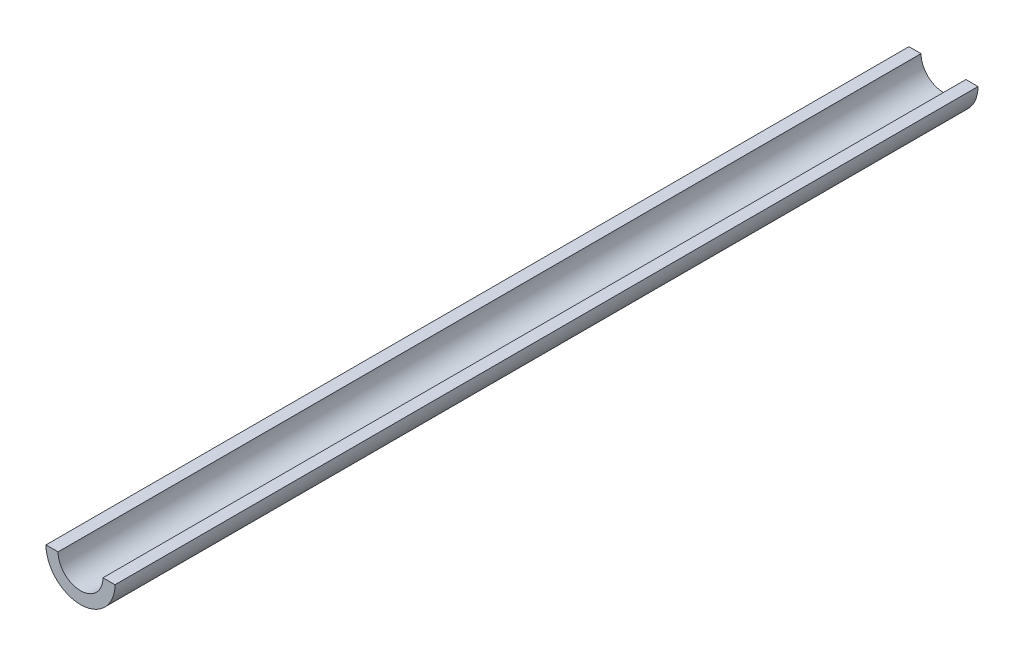
ISO-10303-21;
HEADER;
FILE_DESCRIPTION(('STEP AP214'),'2;1');
FILE_NAME('part.step','',(''),(''),'','','');
FILE_SCHEMA(('AUTOMOTIVE_DESIGN { 1 0 10303 214 1 1 1 1 }'));
ENDSEC;
DATA;
#1=APPLICATION_CONTEXT('core data for automotive mechanical design processes');
#2=APPLICATION_PROTOCOL_DEFINITION('international standard','automotive_design',2000,#1);
#3=PRODUCT_CONTEXT('',#1,'mechanical');
#4=PRODUCT('Part','Part','',(#3));
#5=PRODUCT_RELATED_PRODUCT_CATEGORY('part','',(#4));
#6=PRODUCT_DEFINITION_FORMATION('','',#4);
#7=PRODUCT_DEFINITION_CONTEXT('part definition',#1,'design');
#8=PRODUCT_DEFINITION('design','',#6,#7);
#9=PRODUCT_DEFINITION_SHAPE('','',#8);
#10=(LENGTH_UNIT() NAMED_UNIT(*) SI_UNIT(.MILLI.,.METRE.));
#11=(NAMED_UNIT(*) PLANE_ANGLE_UNIT() SI_UNIT($,.RADIAN.));
#12=(NAMED_UNIT(*) SI_UNIT($,.STERADIAN.) SOLID_ANGLE_UNIT());
#13=UNCERTAINTY_MEASURE_WITH_UNIT(LENGTH_MEASURE(1.E-05),#10,'distance_accuracy_value','');
#14=(GEOMETRIC_REPRESENTATION_CONTEXT(3) GLOBAL_UNCERTAINTY_ASSIGNED_CONTEXT((#13)) GLOBAL_UNIT_ASSIGNED_CONTEXT((#10,
#11,#12)) REPRESENTATION_CONTEXT('',''));
#15=CARTESIAN_POINT('',(0.,0.,0.));
#16=DIRECTION('',(0.,0.,1.));
#17=DIRECTION('',(1.,0.,0.));
#18=AXIS2_PLACEMENT_3D('',#15,#16,#17);
#19=CARTESIAN_POINT('',(0.,0.,125.));
#20=DIRECTION('',(0.,0.,-1.));
#21=DIRECTION('',(-1.,0.,0.));
#22=AXIS2_PLACEMENT_3D('',#19,#20,#21);
#23=CYLINDRICAL_SURFACE('',#22,6.5);
#24=CARTESIAN_POINT('',(0.,0.,-125.));
#25=DIRECTION('',(0.,0.,-1.));
#26=DIRECTION('',(1.,0.,0.));
#27=AXIS2_PLACEMENT_3D('',#24,#25,#26);
#28=CIRCLE('',#27,6.5);
#29=CARTESIAN_POINT('',(6.5,0.,-125.));
#30=VERTEX_POINT('',#29);
#31=CARTESIAN_POINT('',(-6.5,0.,-125.));
#32=VERTEX_POINT('',#31);
#33=EDGE_CURVE('E100',#30,#32,#28,.T.);
#34=ORIENTED_EDGE('',*,*,#33,.T.);
#35=DIRECTION('',(0.,0.,-1.));
#36=VECTOR('',#35,1.);
#37=CARTESIAN_POINT('',(-6.5,0.,125.));
#38=LINE('',#37,#36);
#39=CARTESIAN_POINT('',(-6.5,0.,125.));
#40=VERTEX_POINT('',#39);
#41=EDGE_CURVE('E11',#40,#32,#38,.T.);
#42=ORIENTED_EDGE('',*,*,#41,.F.);
#43=CARTESIAN_POINT('',(0.,0.,125.));
#44=DIRECTION('',(0.,0.,-1.));
#45=DIRECTION('',(1.,0.,0.));
#46=AXIS2_PLACEMENT_3D('',#43,#44,#45);
#47=CIRCLE('',#46,6.5);
#48=CARTESIAN_POINT('',(6.5,0.,125.));
#49=VERTEX_POINT('',#48);
#50=EDGE_CURVE('E88',#49,#40,#47,.T.);
#51=ORIENTED_EDGE('',*,*,#50,.F.);
#52=DIRECTION('',(0.,0.,-1.));
#53=VECTOR('',#52,1.);
#54=CARTESIAN_POINT('',(6.5,0.,125.));
#55=LINE('',#54,#53);
#56=EDGE_CURVE('E96',#49,#30,#55,.T.);
#57=ORIENTED_EDGE('',*,*,#56,.T.);
#58=EDGE_LOOP('',(#34,#42,#51,#57));
#59=FACE_BOUND('',#58,.T.);
#60=ADVANCED_FACE('F37',(#59),#23,.F.);
#61=CARTESIAN_POINT('',(-6.5,0.,125.));
#62=DIRECTION('',(0.,-1.,0.));
#63=DIRECTION('',(1.,0.,0.));
#64=AXIS2_PLACEMENT_3D('',#61,#62,#63);
#65=PLANE('',#64);
#66=DIRECTION('',(-1.,0.,0.));
#67=VECTOR('',#66,1.);
#68=CARTESIAN_POINT('',(-6.5,0.,-125.));
#69=LINE('',#68,#67);
#70=CARTESIAN_POINT('',(-10.,0.,-125.));
#71=VERTEX_POINT('',#70);
#72=EDGE_CURVE('E92',#32,#71,#69,.T.);
#73=ORIENTED_EDGE('',*,*,#72,.T.);
#74=DIRECTION('',(0.,0.,-1.));
#75=VECTOR('',#74,1.);
#76=CARTESIAN_POINT('',(-10.,0.,125.));
#77=LINE('',#76,#75);
#78=CARTESIAN_POINT('',(-10.,0.,125.));
#79=VERTEX_POINT('',#78);
#80=EDGE_CURVE('E45',#79,#71,#77,.T.);
#81=ORIENTED_EDGE('',*,*,#80,.F.);
#82=DIRECTION('',(-1.,0.,0.));
#83=VECTOR('',#82,1.);
#84=CARTESIAN_POINT('',(-6.5,0.,125.));
#85=LINE('',#84,#83);
#86=EDGE_CURVE('E83',#40,#79,#85,.T.);
#87=ORIENTED_EDGE('',*,*,#86,.F.);
#88=ORIENTED_EDGE('',*,*,#41,.T.);
#89=EDGE_LOOP('',(#73,#81,#87,#88));
#90=FACE_BOUND('',#89,.T.);
#91=ADVANCED_FACE('F91',(#90),#65,.F.);
#92=CARTESIAN_POINT('',(0.,0.,125.));
#93=DIRECTION('',(0.,0.,-1.));
#94=DIRECTION('',(-1.,0.,0.));
#95=AXIS2_PLACEMENT_3D('',#92,#93,#94);
#96=CYLINDRICAL_SURFACE('',#95,10.);
#97=CARTESIAN_POINT('',(0.,0.,-125.));
#98=DIRECTION('',(0.,0.,1.));
#99=DIRECTION('',(1.,0.,0.));
#100=AXIS2_PLACEMENT_3D('',#97,#98,#99);
#101=CIRCLE('',#100,10.);
#102=CARTESIAN_POINT('',(10.,0.,-125.));
#103=VERTEX_POINT('',#102);
#104=EDGE_CURVE('E70',#71,#103,#101,.T.);
#105=ORIENTED_EDGE('',*,*,#104,.T.);
#106=DIRECTION('',(0.,0.,-1.));
#107=VECTOR('',#106,1.);
#108=CARTESIAN_POINT('',(10.,0.,125.));
#109=LINE('',#108,#107);
#110=CARTESIAN_POINT('',(10.,0.,125.));
#111=VERTEX_POINT('',#110);
#112=EDGE_CURVE('E93',#111,#103,#109,.T.);
#113=ORIENTED_EDGE('',*,*,#112,.F.);
#114=CARTESIAN_POINT('',(0.,0.,125.));
#115=DIRECTION('',(0.,0.,1.));
#116=DIRECTION('',(1.,0.,0.));
#117=AXIS2_PLACEMENT_3D('',#114,#115,#116);
#118=CIRCLE('',#117,10.);
#119=EDGE_CURVE('E86',#79,#111,#118,.T.);
#120=ORIENTED_EDGE('',*,*,#119,.F.);
#121=ORIENTED_EDGE('',*,*,#80,.T.);
#122=EDGE_LOOP('',(#105,#113,#120,#121));
#123=FACE_BOUND('',#122,.T.);
#124=ADVANCED_FACE('F94',(#123),#96,.T.);
#125=CARTESIAN_POINT('',(6.5,0.,125.));
#126=DIRECTION('',(0.,-1.,0.));
#127=DIRECTION('',(1.,0.,0.));
#128=AXIS2_PLACEMENT_3D('',#125,#126,#127);
#129=PLANE('',#128);
#130=DIRECTION('',(-1.,0.,0.));
#131=VECTOR('',#130,1.);
#132=CARTESIAN_POINT('',(6.5,0.,-125.));
#133=LINE('',#132,#131);
#134=EDGE_CURVE('E76',#103,#30,#133,.T.);
#135=ORIENTED_EDGE('',*,*,#134,.T.);
#136=ORIENTED_EDGE('',*,*,#56,.F.);
#137=DIRECTION('',(-1.,0.,0.));
#138=VECTOR('',#137,1.);
#139=CARTESIAN_POINT('',(6.5,0.,125.));
#140=LINE('',#139,#138);
#141=EDGE_CURVE('E53',#111,#49,#140,.T.);
#142=ORIENTED_EDGE('',*,*,#141,.F.);
#143=ORIENTED_EDGE('',*,*,#112,.T.);
#144=EDGE_LOOP('',(#135,#136,#142,#143));
#145=FACE_BOUND('',#144,.T.);
#146=ADVANCED_FACE('F107',(#145),#129,.F.);
#147=CARTESIAN_POINT('',(0.,0.,125.));
#148=DIRECTION('',(0.,0.,1.));
#149=DIRECTION('',(1.,0.,0.));
#150=AXIS2_PLACEMENT_3D('',#147,#148,#149);
#151=PLANE('',#150);
#152=ORIENTED_EDGE('',*,*,#50,.T.);
#153=ORIENTED_EDGE('',*,*,#86,.T.);
#154=ORIENTED_EDGE('',*,*,#119,.T.);
#155=ORIENTED_EDGE('',*,*,#141,.T.);
#156=EDGE_LOOP('',(#152,#153,#154,#155));
#157=FACE_BOUND('',#156,.T.);
#158=ADVANCED_FACE('F84',(#157),#151,.T.);
#159=CARTESIAN_POINT('',(0.,0.,-125.));
#160=DIRECTION('',(0.,0.,1.));
#161=DIRECTION('',(1.,0.,0.));
#162=AXIS2_PLACEMENT_3D('',#159,#160,#161);
#163=PLANE('',#162);
#164=ORIENTED_EDGE('',*,*,#33,.F.);
#165=ORIENTED_EDGE('',*,*,#134,.F.);
#166=ORIENTED_EDGE('',*,*,#104,.F.);
#167=ORIENTED_EDGE('',*,*,#72,.F.);
#168=EDGE_LOOP('',(#164,#165,#166,#167));
#169=FACE_BOUND('',#168,.T.);
#170=ADVANCED_FACE('F110',(#169),#163,.F.);
#171=CLOSED_SHELL('',(#60,#91,#124,#146,#158,#170));
#172=MANIFOLD_SOLID_BREP('B2',#171);
#173=ADVANCED_BREP_SHAPE_REPRESENTATION('',(#18,#172),#14);
#174=SHAPE_DEFINITION_REPRESENTATION(#9,#173);
ENDSEC;
END-ISO-10303-21;
